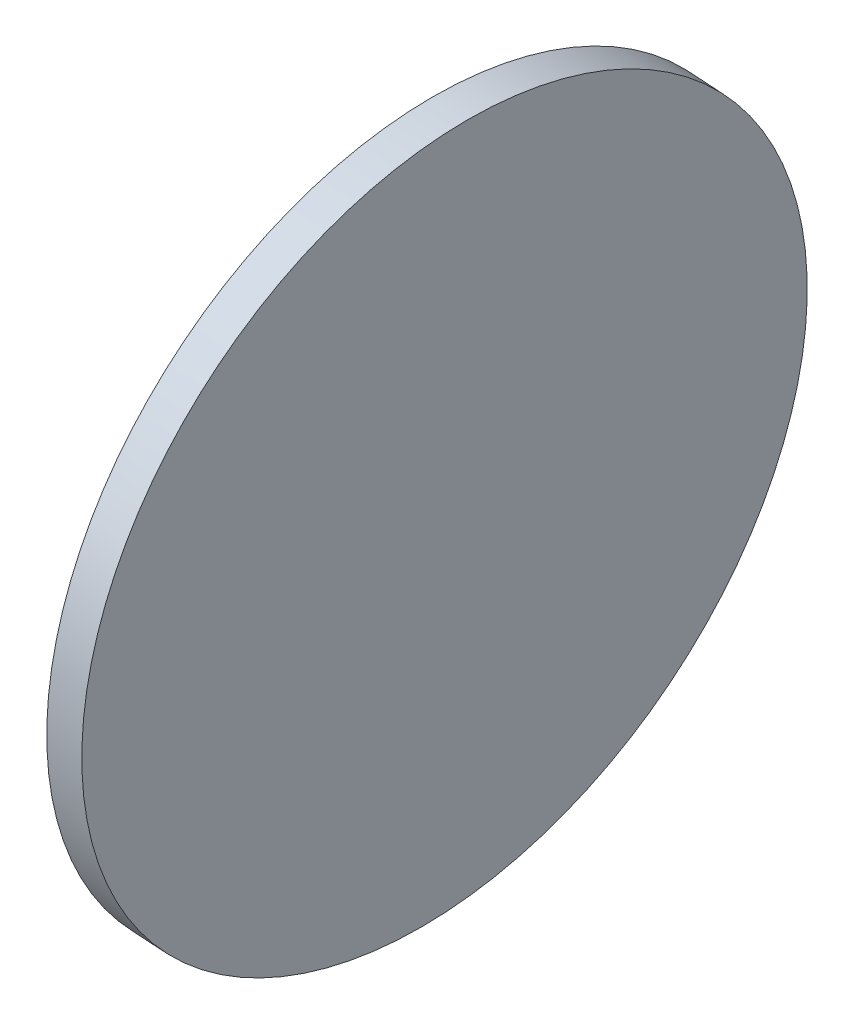
ISO-10303-21;
HEADER;
FILE_DESCRIPTION(('STEP AP214'),'2;1');
FILE_NAME('part.step','',(''),(''),'','','');
FILE_SCHEMA(('AUTOMOTIVE_DESIGN { 1 0 10303 214 1 1 1 1 }'));
ENDSEC;
DATA;
#1=APPLICATION_CONTEXT('core data for automotive mechanical design processes');
#2=APPLICATION_PROTOCOL_DEFINITION('international standard','automotive_design',2000,#1);
#3=PRODUCT_CONTEXT('',#1,'mechanical');
#4=PRODUCT('Part','Part','',(#3));
#5=PRODUCT_RELATED_PRODUCT_CATEGORY('part','',(#4));
#6=PRODUCT_DEFINITION_FORMATION('','',#4);
#7=PRODUCT_DEFINITION_CONTEXT('part definition',#1,'design');
#8=PRODUCT_DEFINITION('design','',#6,#7);
#9=PRODUCT_DEFINITION_SHAPE('','',#8);
#10=(LENGTH_UNIT() NAMED_UNIT(*) SI_UNIT(.MILLI.,.METRE.));
#11=(NAMED_UNIT(*) PLANE_ANGLE_UNIT() SI_UNIT($,.RADIAN.));
#12=(NAMED_UNIT(*) SI_UNIT($,.STERADIAN.) SOLID_ANGLE_UNIT());
#13=UNCERTAINTY_MEASURE_WITH_UNIT(LENGTH_MEASURE(1.E-05),#10,'distance_accuracy_value','');
#14=(GEOMETRIC_REPRESENTATION_CONTEXT(3) GLOBAL_UNCERTAINTY_ASSIGNED_CONTEXT((#13)) GLOBAL_UNIT_ASSIGNED_CONTEXT((#10,
#11,#12)) REPRESENTATION_CONTEXT('',''));
#15=CARTESIAN_POINT('',(0.,0.,0.));
#16=DIRECTION('',(0.,0.,1.));
#17=DIRECTION('',(1.,0.,0.));
#18=AXIS2_PLACEMENT_3D('',#15,#16,#17);
#19=CARTESIAN_POINT('',(-3.406034832293,40.68571062789,-5.36561563708));
#20=DIRECTION('',(0.997942031487261,-0.0641225529051871,0.));
#21=DIRECTION('',(0.0641225529051871,0.997942031487261,0.));
#22=AXIS2_PLACEMENT_3D('',#19,#20,#21);
#23=PLANE('',#22);
#24=CARTESIAN_POINT('',(-3.06226100163264,46.0358774470934,0.));
#25=DIRECTION('',(0.997942031486956,-0.0641225529099351,0.));
#26=DIRECTION('',(0.0641225529099351,0.997942031486956,0.));
#27=AXIS2_PLACEMENT_3D('',#24,#25,#26);
#28=CIRCLE('',#27,5.15499999999565);
#29=CARTESIAN_POINT('',(-2.7317092413822,51.1802686194043,0.));
#30=VERTEX_POINT('',#29);
#31=EDGE_CURVE('E19',#30,#30,#28,.T.);
#32=ORIENTED_EDGE('',*,*,#31,.T.);
#33=EDGE_LOOP('',(#32));
#34=FACE_BOUND('',#33,.T.);
#35=ADVANCED_FACE('F15',(#34),#23,.T.);
#36=CARTESIAN_POINT('',(-3.56123201742704,46.0679387235516,0.));
#37=DIRECTION('',(0.997942031486956,-0.0641225529099351,0.));
#38=DIRECTION('',(0.0641225529099351,0.997942031486956,0.));
#39=AXIS2_PLACEMENT_3D('',#36,#37,#38);
#40=CYLINDRICAL_SURFACE('',#39,5.15499999999565);
#41=ORIENTED_EDGE('',*,*,#31,.F.);
#42=EDGE_LOOP('',(#41));
#43=FACE_BOUND('',#42,.T.);
#44=CARTESIAN_POINT('',(-3.56123201737696,46.0679387235484,0.));
#45=DIRECTION('',(0.997942031486956,-0.0641225529099351,0.));
#46=DIRECTION('',(0.064122552909935,0.997942031486956,0.));
#47=AXIS2_PLACEMENT_3D('',#44,#45,#46);
#48=CIRCLE('',#47,5.15499999999566);
#49=CARTESIAN_POINT('',(-3.23068025712653,51.2123298958593,0.));
#50=VERTEX_POINT('',#49);
#51=EDGE_CURVE('E10',#50,#50,#48,.T.);
#52=ORIENTED_EDGE('',*,*,#51,.T.);
#53=EDGE_LOOP('',(#52));
#54=FACE_BOUND('',#53,.T.);
#55=ADVANCED_FACE('F29',(#43,#54),#40,.T.);
#56=CARTESIAN_POINT('',(-3.905005848036,40.71777190434,-5.36561563708));
#57=DIRECTION('',(0.997942031487271,-0.0641225529050348,0.));
#58=DIRECTION('',(0.0641225529050348,0.997942031487271,0.));
#59=AXIS2_PLACEMENT_3D('',#56,#57,#58);
#60=PLANE('',#59);
#61=ORIENTED_EDGE('',*,*,#51,.F.);
#62=EDGE_LOOP('',(#61));
#63=FACE_BOUND('',#62,.T.);
#64=ADVANCED_FACE('F17',(#63),#60,.F.);
#65=CLOSED_SHELL('',(#35,#55,#64));
#66=MANIFOLD_SOLID_BREP('B1',#65);
#67=ADVANCED_BREP_SHAPE_REPRESENTATION('',(#18,#66),#14);
#68=SHAPE_DEFINITION_REPRESENTATION(#9,#67);
ENDSEC;
END-ISO-10303-21;
